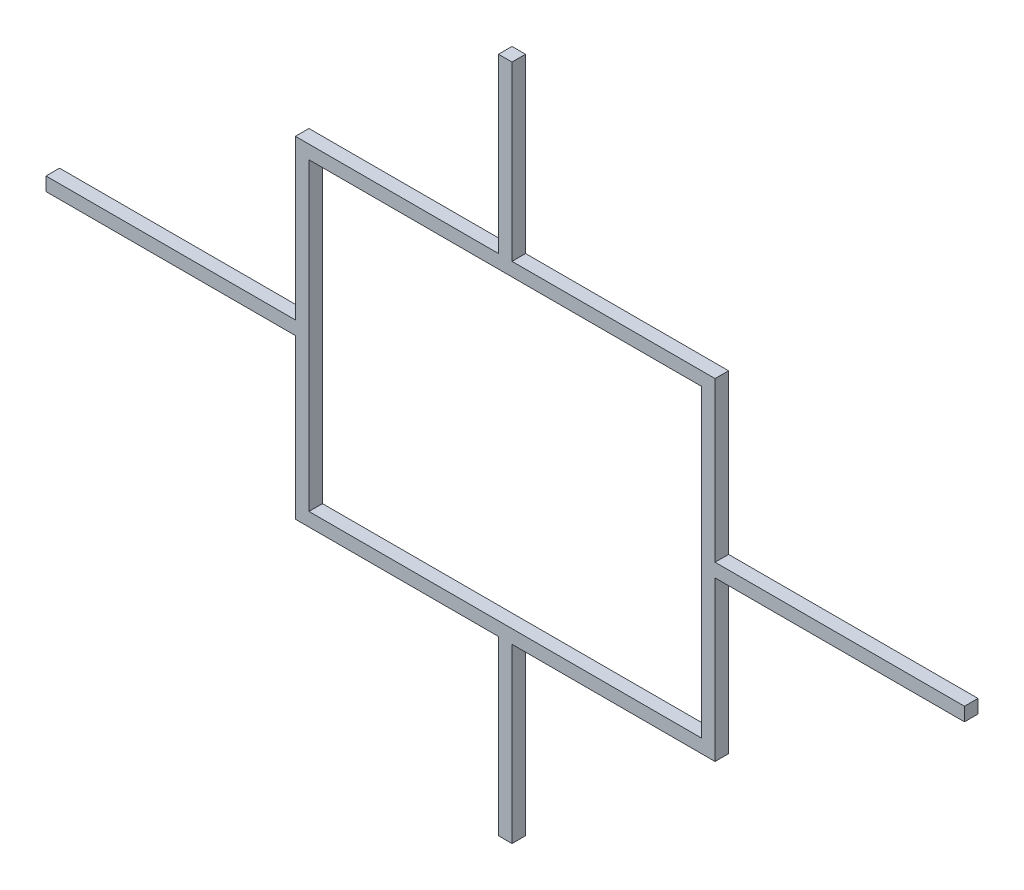
ISO-10303-21;
HEADER;
FILE_DESCRIPTION(('STEP AP214'),'2;1');
FILE_NAME('part.step','',(''),(''),'','','');
FILE_SCHEMA(('AUTOMOTIVE_DESIGN { 1 0 10303 214 1 1 1 1 }'));
ENDSEC;
DATA;
#1=APPLICATION_CONTEXT('core data for automotive mechanical design processes');
#2=APPLICATION_PROTOCOL_DEFINITION('international standard','automotive_design',2000,#1);
#3=PRODUCT_CONTEXT('',#1,'mechanical');
#4=PRODUCT('Part','Part','',(#3));
#5=PRODUCT_RELATED_PRODUCT_CATEGORY('part','',(#4));
#6=PRODUCT_DEFINITION_FORMATION('','',#4);
#7=PRODUCT_DEFINITION_CONTEXT('part definition',#1,'design');
#8=PRODUCT_DEFINITION('design','',#6,#7);
#9=PRODUCT_DEFINITION_SHAPE('','',#8);
#10=(LENGTH_UNIT() NAMED_UNIT(*) SI_UNIT(.MILLI.,.METRE.));
#11=(NAMED_UNIT(*) PLANE_ANGLE_UNIT() SI_UNIT($,.RADIAN.));
#12=(NAMED_UNIT(*) SI_UNIT($,.STERADIAN.) SOLID_ANGLE_UNIT());
#13=UNCERTAINTY_MEASURE_WITH_UNIT(LENGTH_MEASURE(1.E-05),#10,'distance_accuracy_value','');
#14=(GEOMETRIC_REPRESENTATION_CONTEXT(3) GLOBAL_UNCERTAINTY_ASSIGNED_CONTEXT((#13)) GLOBAL_UNIT_ASSIGNED_CONTEXT((#10,
#11,#12)) REPRESENTATION_CONTEXT('',''));
#15=CARTESIAN_POINT('',(0.,0.,0.));
#16=DIRECTION('',(0.,0.,1.));
#17=DIRECTION('',(1.,0.,0.));
#18=AXIS2_PLACEMENT_3D('',#15,#16,#17);
#19=CARTESIAN_POINT('',(0.,0.,20.));
#20=DIRECTION('',(0.,0.,-1.));
#21=DIRECTION('',(-1.,0.,0.));
#22=AXIS2_PLACEMENT_3D('',#19,#20,#21);
#23=PLANE('',#22);
#24=DIRECTION('',(0.,-1.,0.));
#25=VECTOR('',#24,1.);
#26=CARTESIAN_POINT('',(368.5,745.,20.));
#27=LINE('',#26,#25);
#28=CARTESIAN_POINT('',(368.5,745.,20.));
#29=VERTEX_POINT('',#28);
#30=CARTESIAN_POINT('',(368.5,510.,20.));
#31=VERTEX_POINT('',#30);
#32=EDGE_CURVE('E251',#29,#31,#27,.T.);
#33=ORIENTED_EDGE('',*,*,#32,.T.);
#34=DIRECTION('',(-1.,0.,0.));
#35=VECTOR('',#34,1.);
#36=CARTESIAN_POINT('',(368.5,510.,20.));
#37=LINE('',#36,#35);
#38=CARTESIAN_POINT('',(-2.22044604925031E-13,510.,20.));
#39=VERTEX_POINT('',#38);
#40=EDGE_CURVE('E255',#31,#39,#37,.T.);
#41=ORIENTED_EDGE('',*,*,#40,.T.);
#42=DIRECTION('',(0.,-1.,0.));
#43=VECTOR('',#42,1.);
#44=CARTESIAN_POINT('',(-2.22044604925031E-13,510.,20.));
#45=LINE('',#44,#43);
#46=CARTESIAN_POINT('',(0.,490.,20.));
#47=VERTEX_POINT('',#46);
#48=EDGE_CURVE('E259',#39,#47,#45,.T.);
#49=ORIENTED_EDGE('',*,*,#48,.T.);
#50=DIRECTION('',(1.,0.,0.));
#51=VECTOR('',#50,1.);
#52=CARTESIAN_POINT('',(0.,490.,20.));
#53=LINE('',#52,#51);
#54=CARTESIAN_POINT('',(368.5,490.,20.));
#55=VERTEX_POINT('',#54);
#56=EDGE_CURVE('E262',#47,#55,#53,.T.);
#57=ORIENTED_EDGE('',*,*,#56,.T.);
#58=DIRECTION('',(0.,-1.,0.));
#59=VECTOR('',#58,1.);
#60=CARTESIAN_POINT('',(368.5,490.,20.));
#61=LINE('',#60,#59);
#62=CARTESIAN_POINT('',(368.5,255.,20.));
#63=VERTEX_POINT('',#62);
#64=EDGE_CURVE('E265',#55,#63,#61,.T.);
#65=ORIENTED_EDGE('',*,*,#64,.T.);
#66=DIRECTION('',(1.,0.,0.));
#67=VECTOR('',#66,1.);
#68=CARTESIAN_POINT('',(368.5,255.,20.));
#69=LINE('',#68,#67);
#70=CARTESIAN_POINT('',(668.5,255.,20.));
#71=VERTEX_POINT('',#70);
#72=EDGE_CURVE('E268',#63,#71,#69,.T.);
#73=ORIENTED_EDGE('',*,*,#72,.T.);
#74=DIRECTION('',(0.,-1.,0.));
#75=VECTOR('',#74,1.);
#76=CARTESIAN_POINT('',(668.5,255.,20.));
#77=LINE('',#76,#75);
#78=CARTESIAN_POINT('',(668.5,0.,20.));
#79=VERTEX_POINT('',#78);
#80=EDGE_CURVE('E271',#71,#79,#77,.T.);
#81=ORIENTED_EDGE('',*,*,#80,.T.);
#82=DIRECTION('',(1.,0.,0.));
#83=VECTOR('',#82,1.);
#84=CARTESIAN_POINT('',(688.5,0.,20.));
#85=LINE('',#84,#83);
#86=CARTESIAN_POINT('',(688.5,0.,20.));
#87=VERTEX_POINT('',#86);
#88=EDGE_CURVE('E274',#79,#87,#85,.T.);
#89=ORIENTED_EDGE('',*,*,#88,.T.);
#90=DIRECTION('',(0.,1.,0.));
#91=VECTOR('',#90,1.);
#92=CARTESIAN_POINT('',(688.5,255.,20.));
#93=LINE('',#92,#91);
#94=CARTESIAN_POINT('',(688.5,255.,20.));
#95=VERTEX_POINT('',#94);
#96=EDGE_CURVE('E277',#87,#95,#93,.T.);
#97=ORIENTED_EDGE('',*,*,#96,.T.);
#98=DIRECTION('',(1.,0.,0.));
#99=VECTOR('',#98,1.);
#100=CARTESIAN_POINT('',(688.5,255.,20.));
#101=LINE('',#100,#99);
#102=CARTESIAN_POINT('',(988.5,255.,20.));
#103=VERTEX_POINT('',#102);
#104=EDGE_CURVE('E280',#95,#103,#101,.T.);
#105=ORIENTED_EDGE('',*,*,#104,.T.);
#106=DIRECTION('',(0.,1.,0.));
#107=VECTOR('',#106,1.);
#108=CARTESIAN_POINT('',(988.5,490.,20.));
#109=LINE('',#108,#107);
#110=CARTESIAN_POINT('',(988.5,490.,20.));
#111=VERTEX_POINT('',#110);
#112=EDGE_CURVE('E283',#103,#111,#109,.T.);
#113=ORIENTED_EDGE('',*,*,#112,.T.);
#114=DIRECTION('',(1.,0.,0.));
#115=VECTOR('',#114,1.);
#116=CARTESIAN_POINT('',(1357.,490.,20.));
#117=LINE('',#116,#115);
#118=CARTESIAN_POINT('',(1357.,490.,20.));
#119=VERTEX_POINT('',#118);
#120=EDGE_CURVE('E286',#111,#119,#117,.T.);
#121=ORIENTED_EDGE('',*,*,#120,.T.);
#122=DIRECTION('',(0.,1.,0.));
#123=VECTOR('',#122,1.);
#124=CARTESIAN_POINT('',(1357.,510.,20.));
#125=LINE('',#124,#123);
#126=CARTESIAN_POINT('',(1357.,510.,20.));
#127=VERTEX_POINT('',#126);
#128=EDGE_CURVE('E289',#119,#127,#125,.T.);
#129=ORIENTED_EDGE('',*,*,#128,.T.);
#130=DIRECTION('',(-1.,0.,0.));
#131=VECTOR('',#130,1.);
#132=CARTESIAN_POINT('',(988.5,510.,20.));
#133=LINE('',#132,#131);
#134=CARTESIAN_POINT('',(988.5,510.,20.));
#135=VERTEX_POINT('',#134);
#136=EDGE_CURVE('E292',#127,#135,#133,.T.);
#137=ORIENTED_EDGE('',*,*,#136,.T.);
#138=DIRECTION('',(0.,1.,0.));
#139=VECTOR('',#138,1.);
#140=CARTESIAN_POINT('',(988.5,745.,20.));
#141=LINE('',#140,#139);
#142=CARTESIAN_POINT('',(988.5,745.,20.));
#143=VERTEX_POINT('',#142);
#144=EDGE_CURVE('E295',#135,#143,#141,.T.);
#145=ORIENTED_EDGE('',*,*,#144,.T.);
#146=DIRECTION('',(-1.,0.,0.));
#147=VECTOR('',#146,1.);
#148=CARTESIAN_POINT('',(688.5,745.,20.));
#149=LINE('',#148,#147);
#150=CARTESIAN_POINT('',(688.5,745.,20.));
#151=VERTEX_POINT('',#150);
#152=EDGE_CURVE('E298',#143,#151,#149,.T.);
#153=ORIENTED_EDGE('',*,*,#152,.T.);
#154=DIRECTION('',(0.,1.,0.));
#155=VECTOR('',#154,1.);
#156=CARTESIAN_POINT('',(688.5,745.,20.));
#157=LINE('',#156,#155);
#158=CARTESIAN_POINT('',(688.5,1000.,20.));
#159=VERTEX_POINT('',#158);
#160=EDGE_CURVE('E301',#151,#159,#157,.T.);
#161=ORIENTED_EDGE('',*,*,#160,.T.);
#162=DIRECTION('',(-1.,0.,0.));
#163=VECTOR('',#162,1.);
#164=CARTESIAN_POINT('',(688.5,1000.,20.));
#165=LINE('',#164,#163);
#166=CARTESIAN_POINT('',(668.5,1000.,20.));
#167=VERTEX_POINT('',#166);
#168=EDGE_CURVE('E304',#159,#167,#165,.T.);
#169=ORIENTED_EDGE('',*,*,#168,.T.);
#170=DIRECTION('',(0.,-1.,0.));
#171=VECTOR('',#170,1.);
#172=CARTESIAN_POINT('',(668.5,745.,20.));
#173=LINE('',#172,#171);
#174=CARTESIAN_POINT('',(668.5,745.,20.));
#175=VERTEX_POINT('',#174);
#176=EDGE_CURVE('E307',#167,#175,#173,.T.);
#177=ORIENTED_EDGE('',*,*,#176,.T.);
#178=DIRECTION('',(-1.,0.,0.));
#179=VECTOR('',#178,1.);
#180=CARTESIAN_POINT('',(368.5,745.,20.));
#181=LINE('',#180,#179);
#182=EDGE_CURVE('E310',#175,#29,#181,.T.);
#183=ORIENTED_EDGE('',*,*,#182,.T.);
#184=EDGE_LOOP('',(#33,#41,#49,#57,#65,#73,#81,#89,#97,#105,#113,#121,#129,#137,#145,#153,#161,
#169,#177,#183));
#185=FACE_BOUND('',#184,.T.);
#186=DIRECTION('',(0.,1.,0.));
#187=VECTOR('',#186,1.);
#188=CARTESIAN_POINT('',(968.5,725.,20.));
#189=LINE('',#188,#187);
#190=CARTESIAN_POINT('',(968.5,275.,20.));
#191=VERTEX_POINT('',#190);
#192=CARTESIAN_POINT('',(968.5,725.,20.));
#193=VERTEX_POINT('',#192);
#194=EDGE_CURVE('E203',#191,#193,#189,.T.);
#195=ORIENTED_EDGE('',*,*,#194,.F.);
#196=DIRECTION('',(1.,0.,0.));
#197=VECTOR('',#196,1.);
#198=CARTESIAN_POINT('',(388.5,275.,20.));
#199=LINE('',#198,#197);
#200=CARTESIAN_POINT('',(388.5,275.,20.));
#201=VERTEX_POINT('',#200);
#202=EDGE_CURVE('E229',#201,#191,#199,.T.);
#203=ORIENTED_EDGE('',*,*,#202,.F.);
#204=DIRECTION('',(0.,-1.,0.));
#205=VECTOR('',#204,1.);
#206=CARTESIAN_POINT('',(388.5,725.,20.));
#207=LINE('',#206,#205);
#208=CARTESIAN_POINT('',(388.5,725.,20.));
#209=VERTEX_POINT('',#208);
#210=EDGE_CURVE('E225',#209,#201,#207,.T.);
#211=ORIENTED_EDGE('',*,*,#210,.F.);
#212=DIRECTION('',(-1.,0.,0.));
#213=VECTOR('',#212,1.);
#214=CARTESIAN_POINT('',(388.5,725.,20.));
#215=LINE('',#214,#213);
#216=EDGE_CURVE('E212',#193,#209,#215,.T.);
#217=ORIENTED_EDGE('',*,*,#216,.F.);
#218=EDGE_LOOP('',(#195,#203,#211,#217));
#219=FACE_BOUND('',#218,.T.);
#220=ADVANCED_FACE('F41',(#185,#219),#23,.F.);
#221=CARTESIAN_POINT('',(0.,0.,0.));
#222=DIRECTION('',(0.,0.,-1.));
#223=DIRECTION('',(-1.,0.,0.));
#224=AXIS2_PLACEMENT_3D('',#221,#222,#223);
#225=PLANE('',#224);
#226=DIRECTION('',(0.,-1.,0.));
#227=VECTOR('',#226,1.);
#228=CARTESIAN_POINT('',(368.5,745.,0.));
#229=LINE('',#228,#227);
#230=CARTESIAN_POINT('',(368.5,745.,0.));
#231=VERTEX_POINT('',#230);
#232=CARTESIAN_POINT('',(368.5,510.,0.));
#233=VERTEX_POINT('',#232);
#234=EDGE_CURVE('E221',#231,#233,#229,.T.);
#235=ORIENTED_EDGE('',*,*,#234,.F.);
#236=DIRECTION('',(-1.,0.,0.));
#237=VECTOR('',#236,1.);
#238=CARTESIAN_POINT('',(368.5,745.,0.));
#239=LINE('',#238,#237);
#240=CARTESIAN_POINT('',(668.5,745.,0.));
#241=VERTEX_POINT('',#240);
#242=EDGE_CURVE('E256',#241,#231,#239,.T.);
#243=ORIENTED_EDGE('',*,*,#242,.F.);
#244=DIRECTION('',(0.,-1.,0.));
#245=VECTOR('',#244,1.);
#246=CARTESIAN_POINT('',(668.5,745.,0.));
#247=LINE('',#246,#245);
#248=CARTESIAN_POINT('',(668.5,1000.,0.));
#249=VERTEX_POINT('',#248);
#250=EDGE_CURVE('E368',#249,#241,#247,.T.);
#251=ORIENTED_EDGE('',*,*,#250,.F.);
#252=DIRECTION('',(-1.,0.,0.));
#253=VECTOR('',#252,1.);
#254=CARTESIAN_POINT('',(688.5,1000.,0.));
#255=LINE('',#254,#253);
#256=CARTESIAN_POINT('',(688.5,1000.,0.));
#257=VERTEX_POINT('',#256);
#258=EDGE_CURVE('E365',#257,#249,#255,.T.);
#259=ORIENTED_EDGE('',*,*,#258,.F.);
#260=DIRECTION('',(0.,1.,0.));
#261=VECTOR('',#260,1.);
#262=CARTESIAN_POINT('',(688.5,745.,0.));
#263=LINE('',#262,#261);
#264=CARTESIAN_POINT('',(688.5,745.,0.));
#265=VERTEX_POINT('',#264);
#266=EDGE_CURVE('E362',#265,#257,#263,.T.);
#267=ORIENTED_EDGE('',*,*,#266,.F.);
#268=DIRECTION('',(-1.,0.,0.));
#269=VECTOR('',#268,1.);
#270=CARTESIAN_POINT('',(688.5,745.,0.));
#271=LINE('',#270,#269);
#272=CARTESIAN_POINT('',(988.5,745.,0.));
#273=VERTEX_POINT('',#272);
#274=EDGE_CURVE('E359',#273,#265,#271,.T.);
#275=ORIENTED_EDGE('',*,*,#274,.F.);
#276=DIRECTION('',(0.,1.,0.));
#277=VECTOR('',#276,1.);
#278=CARTESIAN_POINT('',(988.5,745.,0.));
#279=LINE('',#278,#277);
#280=CARTESIAN_POINT('',(988.5,510.,0.));
#281=VERTEX_POINT('',#280);
#282=EDGE_CURVE('E356',#281,#273,#279,.T.);
#283=ORIENTED_EDGE('',*,*,#282,.F.);
#284=DIRECTION('',(-1.,0.,0.));
#285=VECTOR('',#284,1.);
#286=CARTESIAN_POINT('',(988.5,510.,0.));
#287=LINE('',#286,#285);
#288=CARTESIAN_POINT('',(1357.,510.,0.));
#289=VERTEX_POINT('',#288);
#290=EDGE_CURVE('E353',#289,#281,#287,.T.);
#291=ORIENTED_EDGE('',*,*,#290,.F.);
#292=DIRECTION('',(0.,1.,0.));
#293=VECTOR('',#292,1.);
#294=CARTESIAN_POINT('',(1357.,510.,0.));
#295=LINE('',#294,#293);
#296=CARTESIAN_POINT('',(1357.,490.,0.));
#297=VERTEX_POINT('',#296);
#298=EDGE_CURVE('E350',#297,#289,#295,.T.);
#299=ORIENTED_EDGE('',*,*,#298,.F.);
#300=DIRECTION('',(1.,0.,0.));
#301=VECTOR('',#300,1.);
#302=CARTESIAN_POINT('',(1357.,490.,0.));
#303=LINE('',#302,#301);
#304=CARTESIAN_POINT('',(988.5,490.,0.));
#305=VERTEX_POINT('',#304);
#306=EDGE_CURVE('E347',#305,#297,#303,.T.);
#307=ORIENTED_EDGE('',*,*,#306,.F.);
#308=DIRECTION('',(0.,1.,0.));
#309=VECTOR('',#308,1.);
#310=CARTESIAN_POINT('',(988.5,490.,0.));
#311=LINE('',#310,#309);
#312=CARTESIAN_POINT('',(988.5,255.,0.));
#313=VERTEX_POINT('',#312);
#314=EDGE_CURVE('E344',#313,#305,#311,.T.);
#315=ORIENTED_EDGE('',*,*,#314,.F.);
#316=DIRECTION('',(1.,0.,0.));
#317=VECTOR('',#316,1.);
#318=CARTESIAN_POINT('',(688.5,255.,0.));
#319=LINE('',#318,#317);
#320=CARTESIAN_POINT('',(688.5,255.,0.));
#321=VERTEX_POINT('',#320);
#322=EDGE_CURVE('E341',#321,#313,#319,.T.);
#323=ORIENTED_EDGE('',*,*,#322,.F.);
#324=DIRECTION('',(0.,1.,0.));
#325=VECTOR('',#324,1.);
#326=CARTESIAN_POINT('',(688.5,255.,0.));
#327=LINE('',#326,#325);
#328=CARTESIAN_POINT('',(688.5,0.,0.));
#329=VERTEX_POINT('',#328);
#330=EDGE_CURVE('E338',#329,#321,#327,.T.);
#331=ORIENTED_EDGE('',*,*,#330,.F.);
#332=DIRECTION('',(1.,0.,0.));
#333=VECTOR('',#332,1.);
#334=CARTESIAN_POINT('',(688.5,0.,0.));
#335=LINE('',#334,#333);
#336=CARTESIAN_POINT('',(668.5,0.,0.));
#337=VERTEX_POINT('',#336);
#338=EDGE_CURVE('E335',#337,#329,#335,.T.);
#339=ORIENTED_EDGE('',*,*,#338,.F.);
#340=DIRECTION('',(0.,-1.,0.));
#341=VECTOR('',#340,1.);
#342=CARTESIAN_POINT('',(668.5,255.,0.));
#343=LINE('',#342,#341);
#344=CARTESIAN_POINT('',(668.5,255.,0.));
#345=VERTEX_POINT('',#344);
#346=EDGE_CURVE('E332',#345,#337,#343,.T.);
#347=ORIENTED_EDGE('',*,*,#346,.F.);
#348=DIRECTION('',(1.,0.,0.));
#349=VECTOR('',#348,1.);
#350=CARTESIAN_POINT('',(368.5,255.,0.));
#351=LINE('',#350,#349);
#352=CARTESIAN_POINT('',(368.5,255.,0.));
#353=VERTEX_POINT('',#352);
#354=EDGE_CURVE('E329',#353,#345,#351,.T.);
#355=ORIENTED_EDGE('',*,*,#354,.F.);
#356=DIRECTION('',(0.,-1.,0.));
#357=VECTOR('',#356,1.);
#358=CARTESIAN_POINT('',(368.5,490.,0.));
#359=LINE('',#358,#357);
#360=CARTESIAN_POINT('',(368.5,490.,0.));
#361=VERTEX_POINT('',#360);
#362=EDGE_CURVE('E326',#361,#353,#359,.T.);
#363=ORIENTED_EDGE('',*,*,#362,.F.);
#364=DIRECTION('',(1.,0.,0.));
#365=VECTOR('',#364,1.);
#366=CARTESIAN_POINT('',(0.,490.,0.));
#367=LINE('',#366,#365);
#368=CARTESIAN_POINT('',(0.,490.,0.));
#369=VERTEX_POINT('',#368);
#370=EDGE_CURVE('E323',#369,#361,#367,.T.);
#371=ORIENTED_EDGE('',*,*,#370,.F.);
#372=DIRECTION('',(0.,-1.,0.));
#373=VECTOR('',#372,1.);
#374=CARTESIAN_POINT('',(-2.22044604925031E-13,510.,0.));
#375=LINE('',#374,#373);
#376=CARTESIAN_POINT('',(-2.22044604925031E-13,510.,0.));
#377=VERTEX_POINT('',#376);
#378=EDGE_CURVE('E320',#377,#369,#375,.T.);
#379=ORIENTED_EDGE('',*,*,#378,.F.);
#380=DIRECTION('',(-1.,0.,0.));
#381=VECTOR('',#380,1.);
#382=CARTESIAN_POINT('',(368.5,510.,0.));
#383=LINE('',#382,#381);
#384=EDGE_CURVE('E317',#233,#377,#383,.T.);
#385=ORIENTED_EDGE('',*,*,#384,.F.);
#386=EDGE_LOOP('',(#235,#243,#251,#259,#267,#275,#283,#291,#299,#307,#315,#323,#331,#339,#347,
#355,#363,#371,#379,#385));
#387=FACE_BOUND('',#386,.T.);
#388=DIRECTION('',(1.,0.,0.));
#389=VECTOR('',#388,1.);
#390=CARTESIAN_POINT('',(388.5,275.,0.));
#391=LINE('',#390,#389);
#392=CARTESIAN_POINT('',(388.5,275.,0.));
#393=VERTEX_POINT('',#392);
#394=CARTESIAN_POINT('',(968.5,275.,0.));
#395=VERTEX_POINT('',#394);
#396=EDGE_CURVE('E213',#393,#395,#391,.T.);
#397=ORIENTED_EDGE('',*,*,#396,.T.);
#398=DIRECTION('',(0.,1.,0.));
#399=VECTOR('',#398,1.);
#400=CARTESIAN_POINT('',(968.5,725.,0.));
#401=LINE('',#400,#399);
#402=CARTESIAN_POINT('',(968.5,725.,0.));
#403=VERTEX_POINT('',#402);
#404=EDGE_CURVE('E65',#395,#403,#401,.T.);
#405=ORIENTED_EDGE('',*,*,#404,.T.);
#406=DIRECTION('',(-1.,0.,0.));
#407=VECTOR('',#406,1.);
#408=CARTESIAN_POINT('',(388.5,725.,0.));
#409=LINE('',#408,#407);
#410=CARTESIAN_POINT('',(388.5,725.,0.));
#411=VERTEX_POINT('',#410);
#412=EDGE_CURVE('E219',#403,#411,#409,.T.);
#413=ORIENTED_EDGE('',*,*,#412,.T.);
#414=DIRECTION('',(0.,-1.,0.));
#415=VECTOR('',#414,1.);
#416=CARTESIAN_POINT('',(388.5,725.,0.));
#417=LINE('',#416,#415);
#418=EDGE_CURVE('E238',#411,#393,#417,.T.);
#419=ORIENTED_EDGE('',*,*,#418,.T.);
#420=EDGE_LOOP('',(#397,#405,#413,#419));
#421=FACE_BOUND('',#420,.T.);
#422=ADVANCED_FACE('F455',(#387,#421),#225,.T.);
#423=CARTESIAN_POINT('',(368.5,745.,20.));
#424=DIRECTION('',(1.,0.,0.));
#425=DIRECTION('',(0.,0.,-1.));
#426=AXIS2_PLACEMENT_3D('',#423,#424,#425);
#427=PLANE('',#426);
#428=ORIENTED_EDGE('',*,*,#234,.T.);
#429=DIRECTION('',(0.,0.,-1.));
#430=VECTOR('',#429,1.);
#431=CARTESIAN_POINT('',(368.5,510.,20.));
#432=LINE('',#431,#430);
#433=EDGE_CURVE('E11',#31,#233,#432,.T.);
#434=ORIENTED_EDGE('',*,*,#433,.F.);
#435=ORIENTED_EDGE('',*,*,#32,.F.);
#436=DIRECTION('',(0.,0.,-1.));
#437=VECTOR('',#436,1.);
#438=CARTESIAN_POINT('',(368.5,745.,20.));
#439=LINE('',#438,#437);
#440=EDGE_CURVE('E313',#29,#231,#439,.T.);
#441=ORIENTED_EDGE('',*,*,#440,.T.);
#442=EDGE_LOOP('',(#428,#434,#435,#441));
#443=FACE_BOUND('',#442,.T.);
#444=ADVANCED_FACE('F43',(#443),#427,.F.);
#445=CARTESIAN_POINT('',(368.5,510.,20.));
#446=DIRECTION('',(0.,-1.,0.));
#447=DIRECTION('',(1.,0.,0.));
#448=AXIS2_PLACEMENT_3D('',#445,#446,#447);
#449=PLANE('',#448);
#450=ORIENTED_EDGE('',*,*,#384,.T.);
#451=DIRECTION('',(0.,0.,-1.));
#452=VECTOR('',#451,1.);
#453=CARTESIAN_POINT('',(-2.22044604925031E-13,510.,20.));
#454=LINE('',#453,#452);
#455=EDGE_CURVE('E50',#39,#377,#454,.T.);
#456=ORIENTED_EDGE('',*,*,#455,.F.);
#457=ORIENTED_EDGE('',*,*,#40,.F.);
#458=ORIENTED_EDGE('',*,*,#433,.T.);
#459=EDGE_LOOP('',(#450,#456,#457,#458));
#460=FACE_BOUND('',#459,.T.);
#461=ADVANCED_FACE('F472',(#460),#449,.F.);
#462=CARTESIAN_POINT('',(-2.22044604925031E-13,510.,20.));
#463=DIRECTION('',(1.,0.,0.));
#464=DIRECTION('',(0.,1.,0.));
#465=AXIS2_PLACEMENT_3D('',#462,#463,#464);
#466=PLANE('',#465);
#467=ORIENTED_EDGE('',*,*,#378,.T.);
#468=DIRECTION('',(0.,0.,-1.));
#469=VECTOR('',#468,1.);
#470=CARTESIAN_POINT('',(0.,490.,20.));
#471=LINE('',#470,#469);
#472=EDGE_CURVE('E440',#47,#369,#471,.T.);
#473=ORIENTED_EDGE('',*,*,#472,.F.);
#474=ORIENTED_EDGE('',*,*,#48,.F.);
#475=ORIENTED_EDGE('',*,*,#455,.T.);
#476=EDGE_LOOP('',(#467,#473,#474,#475));
#477=FACE_BOUND('',#476,.T.);
#478=ADVANCED_FACE('F449',(#477),#466,.F.);
#479=CARTESIAN_POINT('',(0.,490.,20.));
#480=DIRECTION('',(0.,1.,0.));
#481=DIRECTION('',(-1.,0.,0.));
#482=AXIS2_PLACEMENT_3D('',#479,#480,#481);
#483=PLANE('',#482);
#484=ORIENTED_EDGE('',*,*,#370,.T.);
#485=DIRECTION('',(0.,0.,-1.));
#486=VECTOR('',#485,1.);
#487=CARTESIAN_POINT('',(368.5,490.,20.));
#488=LINE('',#487,#486);
#489=EDGE_CURVE('E436',#55,#361,#488,.T.);
#490=ORIENTED_EDGE('',*,*,#489,.F.);
#491=ORIENTED_EDGE('',*,*,#56,.F.);
#492=ORIENTED_EDGE('',*,*,#472,.T.);
#493=EDGE_LOOP('',(#484,#490,#491,#492));
#494=FACE_BOUND('',#493,.T.);
#495=ADVANCED_FACE('F461',(#494),#483,.F.);
#496=CARTESIAN_POINT('',(368.5,490.,20.));
#497=DIRECTION('',(1.,0.,0.));
#498=DIRECTION('',(0.,1.,0.));
#499=AXIS2_PLACEMENT_3D('',#496,#497,#498);
#500=PLANE('',#499);
#501=ORIENTED_EDGE('',*,*,#362,.T.);
#502=DIRECTION('',(0.,0.,-1.));
#503=VECTOR('',#502,1.);
#504=CARTESIAN_POINT('',(368.5,255.,20.));
#505=LINE('',#504,#503);
#506=EDGE_CURVE('E432',#63,#353,#505,.T.);
#507=ORIENTED_EDGE('',*,*,#506,.F.);
#508=ORIENTED_EDGE('',*,*,#64,.F.);
#509=ORIENTED_EDGE('',*,*,#489,.T.);
#510=EDGE_LOOP('',(#501,#507,#508,#509));
#511=FACE_BOUND('',#510,.T.);
#512=ADVANCED_FACE('F465',(#511),#500,.F.);
#513=CARTESIAN_POINT('',(368.5,255.,20.));
#514=DIRECTION('',(0.,1.,0.));
#515=DIRECTION('',(-1.,0.,0.));
#516=AXIS2_PLACEMENT_3D('',#513,#514,#515);
#517=PLANE('',#516);
#518=ORIENTED_EDGE('',*,*,#354,.T.);
#519=DIRECTION('',(0.,0.,-1.));
#520=VECTOR('',#519,1.);
#521=CARTESIAN_POINT('',(668.5,255.,20.));
#522=LINE('',#521,#520);
#523=EDGE_CURVE('E428',#71,#345,#522,.T.);
#524=ORIENTED_EDGE('',*,*,#523,.F.);
#525=ORIENTED_EDGE('',*,*,#72,.F.);
#526=ORIENTED_EDGE('',*,*,#506,.T.);
#527=EDGE_LOOP('',(#518,#524,#525,#526));
#528=FACE_BOUND('',#527,.T.);
#529=ADVANCED_FACE('F545',(#528),#517,.F.);
#530=CARTESIAN_POINT('',(668.5,255.,20.));
#531=DIRECTION('',(1.,0.,0.));
#532=DIRECTION('',(0.,0.,-1.));
#533=AXIS2_PLACEMENT_3D('',#530,#531,#532);
#534=PLANE('',#533);
#535=ORIENTED_EDGE('',*,*,#346,.T.);
#536=DIRECTION('',(0.,0.,-1.));
#537=VECTOR('',#536,1.);
#538=CARTESIAN_POINT('',(668.5,0.,20.));
#539=LINE('',#538,#537);
#540=EDGE_CURVE('E424',#79,#337,#539,.T.);
#541=ORIENTED_EDGE('',*,*,#540,.F.);
#542=ORIENTED_EDGE('',*,*,#80,.F.);
#543=ORIENTED_EDGE('',*,*,#523,.T.);
#544=EDGE_LOOP('',(#535,#541,#542,#543));
#545=FACE_BOUND('',#544,.T.);
#546=ADVANCED_FACE('F543',(#545),#534,.F.);
#547=CARTESIAN_POINT('',(688.5,0.,20.));
#548=DIRECTION('',(0.,1.,0.));
#549=DIRECTION('',(0.,0.,1.));
#550=AXIS2_PLACEMENT_3D('',#547,#548,#549);
#551=PLANE('',#550);
#552=ORIENTED_EDGE('',*,*,#338,.T.);
#553=DIRECTION('',(0.,0.,-1.));
#554=VECTOR('',#553,1.);
#555=CARTESIAN_POINT('',(688.5,0.,20.));
#556=LINE('',#555,#554);
#557=EDGE_CURVE('E420',#87,#329,#556,.T.);
#558=ORIENTED_EDGE('',*,*,#557,.F.);
#559=ORIENTED_EDGE('',*,*,#88,.F.);
#560=ORIENTED_EDGE('',*,*,#540,.T.);
#561=EDGE_LOOP('',(#552,#558,#559,#560));
#562=FACE_BOUND('',#561,.T.);
#563=ADVANCED_FACE('F538',(#562),#551,.F.);
#564=CARTESIAN_POINT('',(688.5,255.,20.));
#565=DIRECTION('',(-1.,0.,0.));
#566=DIRECTION('',(0.,0.,1.));
#567=AXIS2_PLACEMENT_3D('',#564,#565,#566);
#568=PLANE('',#567);
#569=ORIENTED_EDGE('',*,*,#330,.T.);
#570=DIRECTION('',(0.,0.,-1.));
#571=VECTOR('',#570,1.);
#572=CARTESIAN_POINT('',(688.5,255.,20.));
#573=LINE('',#572,#571);
#574=EDGE_CURVE('E416',#95,#321,#573,.T.);
#575=ORIENTED_EDGE('',*,*,#574,.F.);
#576=ORIENTED_EDGE('',*,*,#96,.F.);
#577=ORIENTED_EDGE('',*,*,#557,.T.);
#578=EDGE_LOOP('',(#569,#575,#576,#577));
#579=FACE_BOUND('',#578,.T.);
#580=ADVANCED_FACE('F533',(#579),#568,.F.);
#581=CARTESIAN_POINT('',(688.5,255.,20.));
#582=DIRECTION('',(0.,1.,0.));
#583=DIRECTION('',(-1.,0.,0.));
#584=AXIS2_PLACEMENT_3D('',#581,#582,#583);
#585=PLANE('',#584);
#586=ORIENTED_EDGE('',*,*,#322,.T.);
#587=DIRECTION('',(0.,0.,-1.));
#588=VECTOR('',#587,1.);
#589=CARTESIAN_POINT('',(988.5,255.,20.));
#590=LINE('',#589,#588);
#591=EDGE_CURVE('E412',#103,#313,#590,.T.);
#592=ORIENTED_EDGE('',*,*,#591,.F.);
#593=ORIENTED_EDGE('',*,*,#104,.F.);
#594=ORIENTED_EDGE('',*,*,#574,.T.);
#595=EDGE_LOOP('',(#586,#592,#593,#594));
#596=FACE_BOUND('',#595,.T.);
#597=ADVANCED_FACE('F529',(#596),#585,.F.);
#598=CARTESIAN_POINT('',(988.5,490.,20.));
#599=DIRECTION('',(-1.,0.,0.));
#600=DIRECTION('',(0.,0.,1.));
#601=AXIS2_PLACEMENT_3D('',#598,#599,#600);
#602=PLANE('',#601);
#603=ORIENTED_EDGE('',*,*,#314,.T.);
#604=DIRECTION('',(0.,0.,-1.));
#605=VECTOR('',#604,1.);
#606=CARTESIAN_POINT('',(988.5,490.,20.));
#607=LINE('',#606,#605);
#608=EDGE_CURVE('E408',#111,#305,#607,.T.);
#609=ORIENTED_EDGE('',*,*,#608,.F.);
#610=ORIENTED_EDGE('',*,*,#112,.F.);
#611=ORIENTED_EDGE('',*,*,#591,.T.);
#612=EDGE_LOOP('',(#603,#609,#610,#611));
#613=FACE_BOUND('',#612,.T.);
#614=ADVANCED_FACE('F524',(#613),#602,.F.);
#615=CARTESIAN_POINT('',(1357.,490.,20.));
#616=DIRECTION('',(0.,1.,0.));
#617=DIRECTION('',(-1.,0.,0.));
#618=AXIS2_PLACEMENT_3D('',#615,#616,#617);
#619=PLANE('',#618);
#620=ORIENTED_EDGE('',*,*,#306,.T.);
#621=DIRECTION('',(0.,0.,-1.));
#622=VECTOR('',#621,1.);
#623=CARTESIAN_POINT('',(1357.,490.,20.));
#624=LINE('',#623,#622);
#625=EDGE_CURVE('E404',#119,#297,#624,.T.);
#626=ORIENTED_EDGE('',*,*,#625,.F.);
#627=ORIENTED_EDGE('',*,*,#120,.F.);
#628=ORIENTED_EDGE('',*,*,#608,.T.);
#629=EDGE_LOOP('',(#620,#626,#627,#628));
#630=FACE_BOUND('',#629,.T.);
#631=ADVANCED_FACE('F518',(#630),#619,.F.);
#632=CARTESIAN_POINT('',(1357.,510.,20.));
#633=DIRECTION('',(-1.,0.,0.));
#634=DIRECTION('',(0.,0.,1.));
#635=AXIS2_PLACEMENT_3D('',#632,#633,#634);
#636=PLANE('',#635);
#637=ORIENTED_EDGE('',*,*,#298,.T.);
#638=DIRECTION('',(0.,0.,-1.));
#639=VECTOR('',#638,1.);
#640=CARTESIAN_POINT('',(1357.,510.,20.));
#641=LINE('',#640,#639);
#642=EDGE_CURVE('E400',#127,#289,#641,.T.);
#643=ORIENTED_EDGE('',*,*,#642,.F.);
#644=ORIENTED_EDGE('',*,*,#128,.F.);
#645=ORIENTED_EDGE('',*,*,#625,.T.);
#646=EDGE_LOOP('',(#637,#643,#644,#645));
#647=FACE_BOUND('',#646,.T.);
#648=ADVANCED_FACE('F514',(#647),#636,.F.);
#649=CARTESIAN_POINT('',(988.5,510.,20.));
#650=DIRECTION('',(0.,-1.,0.));
#651=DIRECTION('',(0.,0.,-1.));
#652=AXIS2_PLACEMENT_3D('',#649,#650,#651);
#653=PLANE('',#652);
#654=ORIENTED_EDGE('',*,*,#290,.T.);
#655=DIRECTION('',(0.,0.,-1.));
#656=VECTOR('',#655,1.);
#657=CARTESIAN_POINT('',(988.5,510.,20.));
#658=LINE('',#657,#656);
#659=EDGE_CURVE('E396',#135,#281,#658,.T.);
#660=ORIENTED_EDGE('',*,*,#659,.F.);
#661=ORIENTED_EDGE('',*,*,#136,.F.);
#662=ORIENTED_EDGE('',*,*,#642,.T.);
#663=EDGE_LOOP('',(#654,#660,#661,#662));
#664=FACE_BOUND('',#663,.T.);
#665=ADVANCED_FACE('F509',(#664),#653,.F.);
#666=CARTESIAN_POINT('',(988.5,745.,20.));
#667=DIRECTION('',(-1.,0.,0.));
#668=DIRECTION('',(0.,0.,1.));
#669=AXIS2_PLACEMENT_3D('',#666,#667,#668);
#670=PLANE('',#669);
#671=ORIENTED_EDGE('',*,*,#282,.T.);
#672=DIRECTION('',(0.,0.,-1.));
#673=VECTOR('',#672,1.);
#674=CARTESIAN_POINT('',(988.5,745.,20.));
#675=LINE('',#674,#673);
#676=EDGE_CURVE('E392',#143,#273,#675,.T.);
#677=ORIENTED_EDGE('',*,*,#676,.F.);
#678=ORIENTED_EDGE('',*,*,#144,.F.);
#679=ORIENTED_EDGE('',*,*,#659,.T.);
#680=EDGE_LOOP('',(#671,#677,#678,#679));
#681=FACE_BOUND('',#680,.T.);
#682=ADVANCED_FACE('F503',(#681),#670,.F.);
#683=CARTESIAN_POINT('',(688.5,745.,20.));
#684=DIRECTION('',(0.,-1.,0.));
#685=DIRECTION('',(0.,0.,-1.));
#686=AXIS2_PLACEMENT_3D('',#683,#684,#685);
#687=PLANE('',#686);
#688=ORIENTED_EDGE('',*,*,#274,.T.);
#689=DIRECTION('',(0.,0.,-1.));
#690=VECTOR('',#689,1.);
#691=CARTESIAN_POINT('',(688.5,745.,20.));
#692=LINE('',#691,#690);
#693=EDGE_CURVE('E388',#151,#265,#692,.T.);
#694=ORIENTED_EDGE('',*,*,#693,.F.);
#695=ORIENTED_EDGE('',*,*,#152,.F.);
#696=ORIENTED_EDGE('',*,*,#676,.T.);
#697=EDGE_LOOP('',(#688,#694,#695,#696));
#698=FACE_BOUND('',#697,.T.);
#699=ADVANCED_FACE('F499',(#698),#687,.F.);
#700=CARTESIAN_POINT('',(688.5,745.,20.));
#701=DIRECTION('',(-1.,0.,0.));
#702=DIRECTION('',(0.,0.,1.));
#703=AXIS2_PLACEMENT_3D('',#700,#701,#702);
#704=PLANE('',#703);
#705=ORIENTED_EDGE('',*,*,#266,.T.);
#706=DIRECTION('',(0.,0.,-1.));
#707=VECTOR('',#706,1.);
#708=CARTESIAN_POINT('',(688.5,1000.,20.));
#709=LINE('',#708,#707);
#710=EDGE_CURVE('E384',#159,#257,#709,.T.);
#711=ORIENTED_EDGE('',*,*,#710,.F.);
#712=ORIENTED_EDGE('',*,*,#160,.F.);
#713=ORIENTED_EDGE('',*,*,#693,.T.);
#714=EDGE_LOOP('',(#705,#711,#712,#713));
#715=FACE_BOUND('',#714,.T.);
#716=ADVANCED_FACE('F494',(#715),#704,.F.);
#717=CARTESIAN_POINT('',(688.5,1000.,20.));
#718=DIRECTION('',(0.,-1.,0.));
#719=DIRECTION('',(0.,0.,-1.));
#720=AXIS2_PLACEMENT_3D('',#717,#718,#719);
#721=PLANE('',#720);
#722=ORIENTED_EDGE('',*,*,#258,.T.);
#723=DIRECTION('',(0.,0.,-1.));
#724=VECTOR('',#723,1.);
#725=CARTESIAN_POINT('',(668.5,1000.,20.));
#726=LINE('',#725,#724);
#727=EDGE_CURVE('E380',#167,#249,#726,.T.);
#728=ORIENTED_EDGE('',*,*,#727,.F.);
#729=ORIENTED_EDGE('',*,*,#168,.F.);
#730=ORIENTED_EDGE('',*,*,#710,.T.);
#731=EDGE_LOOP('',(#722,#728,#729,#730));
#732=FACE_BOUND('',#731,.T.);
#733=ADVANCED_FACE('F488',(#732),#721,.F.);
#734=CARTESIAN_POINT('',(668.5,745.,20.));
#735=DIRECTION('',(1.,0.,0.));
#736=DIRECTION('',(0.,0.,-1.));
#737=AXIS2_PLACEMENT_3D('',#734,#735,#736);
#738=PLANE('',#737);
#739=ORIENTED_EDGE('',*,*,#250,.T.);
#740=DIRECTION('',(0.,0.,-1.));
#741=VECTOR('',#740,1.);
#742=CARTESIAN_POINT('',(668.5,745.,20.));
#743=LINE('',#742,#741);
#744=EDGE_CURVE('E376',#175,#241,#743,.T.);
#745=ORIENTED_EDGE('',*,*,#744,.F.);
#746=ORIENTED_EDGE('',*,*,#176,.F.);
#747=ORIENTED_EDGE('',*,*,#727,.T.);
#748=EDGE_LOOP('',(#739,#745,#746,#747));
#749=FACE_BOUND('',#748,.T.);
#750=ADVANCED_FACE('F484',(#749),#738,.F.);
#751=CARTESIAN_POINT('',(368.5,745.,20.));
#752=DIRECTION('',(0.,-1.,0.));
#753=DIRECTION('',(0.,0.,-1.));
#754=AXIS2_PLACEMENT_3D('',#751,#752,#753);
#755=PLANE('',#754);
#756=ORIENTED_EDGE('',*,*,#242,.T.);
#757=ORIENTED_EDGE('',*,*,#440,.F.);
#758=ORIENTED_EDGE('',*,*,#182,.F.);
#759=ORIENTED_EDGE('',*,*,#744,.T.);
#760=EDGE_LOOP('',(#756,#757,#758,#759));
#761=FACE_BOUND('',#760,.T.);
#762=ADVANCED_FACE('F479',(#761),#755,.F.);
#763=CARTESIAN_POINT('',(968.5,725.,20.));
#764=DIRECTION('',(-1.,0.,0.));
#765=DIRECTION('',(0.,0.,1.));
#766=AXIS2_PLACEMENT_3D('',#763,#764,#765);
#767=PLANE('',#766);
#768=ORIENTED_EDGE('',*,*,#404,.F.);
#769=DIRECTION('',(0.,0.,-1.));
#770=VECTOR('',#769,1.);
#771=CARTESIAN_POINT('',(968.5,275.,20.));
#772=LINE('',#771,#770);
#773=EDGE_CURVE('E207',#191,#395,#772,.T.);
#774=ORIENTED_EDGE('',*,*,#773,.F.);
#775=ORIENTED_EDGE('',*,*,#194,.T.);
#776=DIRECTION('',(0.,0.,-1.));
#777=VECTOR('',#776,1.);
#778=CARTESIAN_POINT('',(968.5,725.,20.));
#779=LINE('',#778,#777);
#780=EDGE_CURVE('E206',#193,#403,#779,.T.);
#781=ORIENTED_EDGE('',*,*,#780,.T.);
#782=EDGE_LOOP('',(#768,#774,#775,#781));
#783=FACE_BOUND('',#782,.T.);
#784=ADVANCED_FACE('F205',(#783),#767,.T.);
#785=CARTESIAN_POINT('',(388.5,725.,20.));
#786=DIRECTION('',(0.,-1.,0.));
#787=DIRECTION('',(0.,0.,-1.));
#788=AXIS2_PLACEMENT_3D('',#785,#786,#787);
#789=PLANE('',#788);
#790=ORIENTED_EDGE('',*,*,#412,.F.);
#791=ORIENTED_EDGE('',*,*,#780,.F.);
#792=ORIENTED_EDGE('',*,*,#216,.T.);
#793=DIRECTION('',(0.,0.,-1.));
#794=VECTOR('',#793,1.);
#795=CARTESIAN_POINT('',(388.5,725.,20.));
#796=LINE('',#795,#794);
#797=EDGE_CURVE('E222',#209,#411,#796,.T.);
#798=ORIENTED_EDGE('',*,*,#797,.T.);
#799=EDGE_LOOP('',(#790,#791,#792,#798));
#800=FACE_BOUND('',#799,.T.);
#801=ADVANCED_FACE('F216',(#800),#789,.T.);
#802=CARTESIAN_POINT('',(388.5,725.,20.));
#803=DIRECTION('',(1.,0.,0.));
#804=DIRECTION('',(0.,1.,0.));
#805=AXIS2_PLACEMENT_3D('',#802,#803,#804);
#806=PLANE('',#805);
#807=ORIENTED_EDGE('',*,*,#418,.F.);
#808=ORIENTED_EDGE('',*,*,#797,.F.);
#809=ORIENTED_EDGE('',*,*,#210,.T.);
#810=DIRECTION('',(0.,0.,-1.));
#811=VECTOR('',#810,1.);
#812=CARTESIAN_POINT('',(388.5,275.,20.));
#813=LINE('',#812,#811);
#814=EDGE_CURVE('E57',#201,#393,#813,.T.);
#815=ORIENTED_EDGE('',*,*,#814,.T.);
#816=EDGE_LOOP('',(#807,#808,#809,#815));
#817=FACE_BOUND('',#816,.T.);
#818=ADVANCED_FACE('F651',(#817),#806,.T.);
#819=CARTESIAN_POINT('',(388.5,275.,20.));
#820=DIRECTION('',(0.,1.,0.));
#821=DIRECTION('',(0.,0.,1.));
#822=AXIS2_PLACEMENT_3D('',#819,#820,#821);
#823=PLANE('',#822);
#824=ORIENTED_EDGE('',*,*,#396,.F.);
#825=ORIENTED_EDGE('',*,*,#814,.F.);
#826=ORIENTED_EDGE('',*,*,#202,.T.);
#827=ORIENTED_EDGE('',*,*,#773,.T.);
#828=EDGE_LOOP('',(#824,#825,#826,#827));
#829=FACE_BOUND('',#828,.T.);
#830=ADVANCED_FACE('F657',(#829),#823,.T.);
#831=CLOSED_SHELL('',(#220,#422,#444,#461,#478,#495,#512,#529,#546,#563,#580,#597,#614,#631,
#648,#665,#682,#699,#716,#733,#750,#762,#784,#801,#818,#830));
#832=MANIFOLD_SOLID_BREP('B2',#831);
#833=ADVANCED_BREP_SHAPE_REPRESENTATION('',(#18,#832),#14);
#834=SHAPE_DEFINITION_REPRESENTATION(#9,#833);
ENDSEC;
END-ISO-10303-21;
